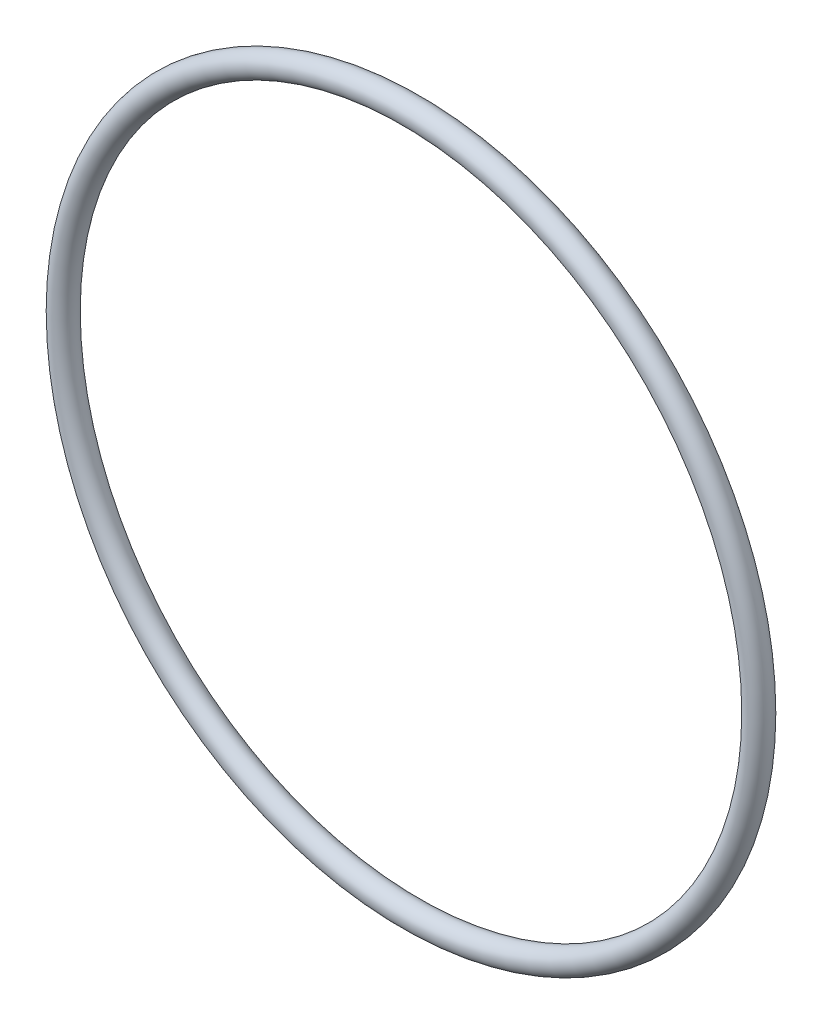
ISO-10303-21;
HEADER;
FILE_DESCRIPTION(('STEP AP214'),'2;1');
FILE_NAME('part.step','',(''),(''),'','','');
FILE_SCHEMA(('AUTOMOTIVE_DESIGN { 1 0 10303 214 1 1 1 1 }'));
ENDSEC;
DATA;
#1=APPLICATION_CONTEXT('core data for automotive mechanical design processes');
#2=APPLICATION_PROTOCOL_DEFINITION('international standard','automotive_design',2000,#1);
#3=PRODUCT_CONTEXT('',#1,'mechanical');
#4=PRODUCT('Part','Part','',(#3));
#5=PRODUCT_RELATED_PRODUCT_CATEGORY('part','',(#4));
#6=PRODUCT_DEFINITION_FORMATION('','',#4);
#7=PRODUCT_DEFINITION_CONTEXT('part definition',#1,'design');
#8=PRODUCT_DEFINITION('design','',#6,#7);
#9=PRODUCT_DEFINITION_SHAPE('','',#8);
#10=(LENGTH_UNIT() NAMED_UNIT(*) SI_UNIT(.MILLI.,.METRE.));
#11=(NAMED_UNIT(*) PLANE_ANGLE_UNIT() SI_UNIT($,.RADIAN.));
#12=(NAMED_UNIT(*) SI_UNIT($,.STERADIAN.) SOLID_ANGLE_UNIT());
#13=UNCERTAINTY_MEASURE_WITH_UNIT(LENGTH_MEASURE(1.E-05),#10,'distance_accuracy_value','');
#14=(GEOMETRIC_REPRESENTATION_CONTEXT(3) GLOBAL_UNCERTAINTY_ASSIGNED_CONTEXT((#13)) GLOBAL_UNIT_ASSIGNED_CONTEXT((#10,
#11,#12)) REPRESENTATION_CONTEXT('',''));
#15=CARTESIAN_POINT('',(0.,0.,0.));
#16=DIRECTION('',(0.,0.,1.));
#17=DIRECTION('',(1.,0.,0.));
#18=AXIS2_PLACEMENT_3D('',#15,#16,#17);
#19=CARTESIAN_POINT('',(0.,0.,0.));
#20=DIRECTION('',(0.,0.,1.));
#21=DIRECTION('',(1.,0.,0.));
#22=AXIS2_PLACEMENT_3D('',#19,#20,#21);
#23=TOROIDAL_SURFACE('',#22,76.962,2.667);
#24=CARTESIAN_POINT('',(79.629,0.,0.));
#25=VERTEX_POINT('',#24);
#26=VERTEX_LOOP('',#25);
#27=FACE_BOUND('',#26,.T.);
#28=ADVANCED_FACE('F30',(#27),#23,.T.);
#29=CLOSED_SHELL('',(#28));
#30=MANIFOLD_SOLID_BREP('B2',#29);
#31=ADVANCED_BREP_SHAPE_REPRESENTATION('',(#18,#30),#14);
#32=SHAPE_DEFINITION_REPRESENTATION(#9,#31);
ENDSEC;
END-ISO-10303-21;
